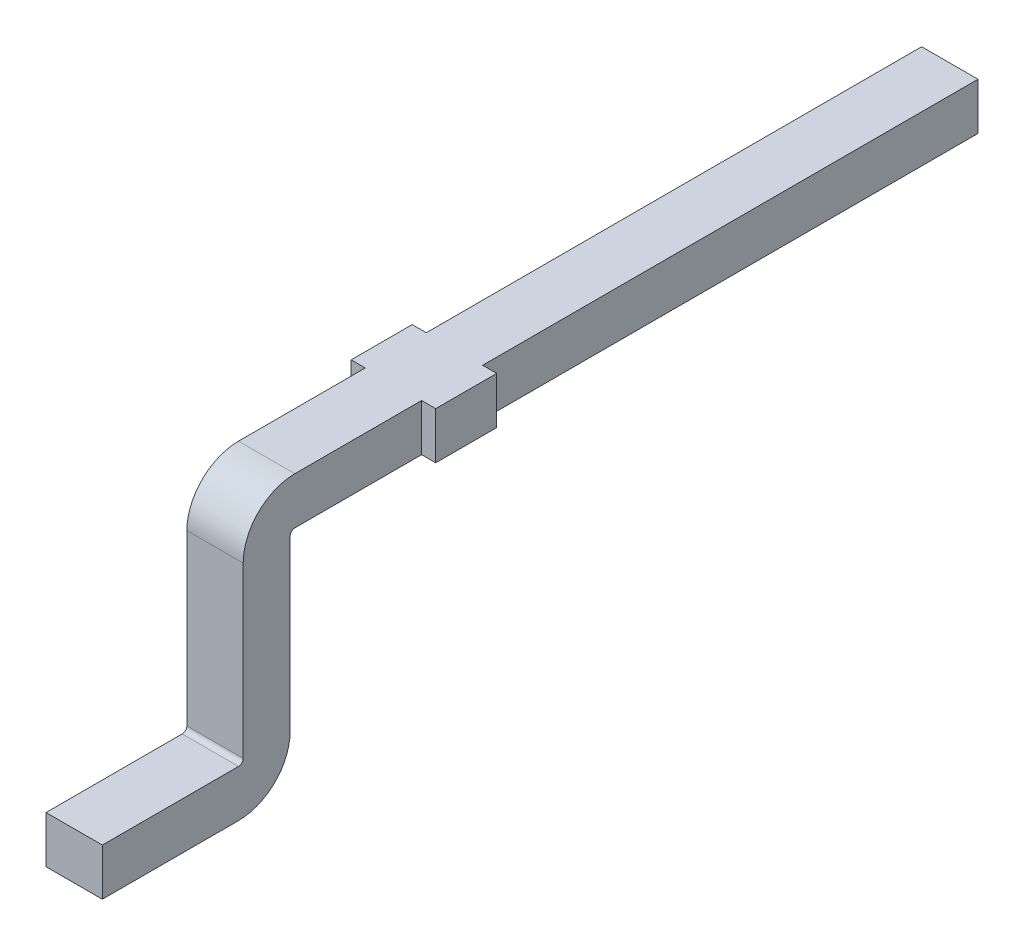
ISO-10303-21;
HEADER;
FILE_DESCRIPTION(('STEP AP214'),'2;1');
FILE_NAME('part.step','',(''),(''),'','','');
FILE_SCHEMA(('AUTOMOTIVE_DESIGN { 1 0 10303 214 1 1 1 1 }'));
ENDSEC;
DATA;
#1=APPLICATION_CONTEXT('core data for automotive mechanical design processes');
#2=APPLICATION_PROTOCOL_DEFINITION('international standard','automotive_design',2000,#1);
#3=PRODUCT_CONTEXT('',#1,'mechanical');
#4=PRODUCT('Part','Part','',(#3));
#5=PRODUCT_RELATED_PRODUCT_CATEGORY('part','',(#4));
#6=PRODUCT_DEFINITION_FORMATION('','',#4);
#7=PRODUCT_DEFINITION_CONTEXT('part definition',#1,'design');
#8=PRODUCT_DEFINITION('design','',#6,#7);
#9=PRODUCT_DEFINITION_SHAPE('','',#8);
#10=(LENGTH_UNIT() NAMED_UNIT(*) SI_UNIT(.MILLI.,.METRE.));
#11=(NAMED_UNIT(*) PLANE_ANGLE_UNIT() SI_UNIT($,.RADIAN.));
#12=(NAMED_UNIT(*) SI_UNIT($,.STERADIAN.) SOLID_ANGLE_UNIT());
#13=UNCERTAINTY_MEASURE_WITH_UNIT(LENGTH_MEASURE(1.E-05),#10,'distance_accuracy_value','');
#14=(GEOMETRIC_REPRESENTATION_CONTEXT(3) GLOBAL_UNCERTAINTY_ASSIGNED_CONTEXT((#13)) GLOBAL_UNIT_ASSIGNED_CONTEXT((#10,
#11,#12)) REPRESENTATION_CONTEXT('',''));
#15=CARTESIAN_POINT('',(0.,0.,0.));
#16=DIRECTION('',(0.,0.,1.));
#17=DIRECTION('',(1.,0.,0.));
#18=AXIS2_PLACEMENT_3D('',#15,#16,#17);
#19=CARTESIAN_POINT('',(5.,2.4,0.));
#20=DIRECTION('',(0.,0.,1.));
#21=DIRECTION('',(1.,0.,0.));
#22=AXIS2_PLACEMENT_3D('',#19,#20,#21);
#23=PLANE('',#22);
#24=DIRECTION('',(-1.,0.,0.));
#25=VECTOR('',#24,1.);
#26=CARTESIAN_POINT('',(5.,2.9,0.));
#27=LINE('',#26,#25);
#28=CARTESIAN_POINT('',(0.3,2.9,0.));
#29=VERTEX_POINT('',#28);
#30=CARTESIAN_POINT('',(-0.3,2.9,0.));
#31=VERTEX_POINT('',#30);
#32=EDGE_CURVE('E41',#29,#31,#27,.T.);
#33=ORIENTED_EDGE('',*,*,#32,.F.);
#34=DIRECTION('',(0.,-1.,0.));
#35=VECTOR('',#34,1.);
#36=CARTESIAN_POINT('',(0.3,2.9,0.));
#37=LINE('',#36,#35);
#38=CARTESIAN_POINT('',(0.3,2.4,0.));
#39=VERTEX_POINT('',#38);
#40=EDGE_CURVE('E11',#29,#39,#37,.T.);
#41=ORIENTED_EDGE('',*,*,#40,.T.);
#42=DIRECTION('',(-1.,0.,0.));
#43=VECTOR('',#42,1.);
#44=CARTESIAN_POINT('',(5.,2.4,0.));
#45=LINE('',#44,#43);
#46=CARTESIAN_POINT('',(-0.3,2.4,0.));
#47=VERTEX_POINT('',#46);
#48=EDGE_CURVE('E27',#39,#47,#45,.T.);
#49=ORIENTED_EDGE('',*,*,#48,.T.);
#50=DIRECTION('',(0.,-1.,0.));
#51=VECTOR('',#50,1.);
#52=CARTESIAN_POINT('',(-0.3,2.9,0.));
#53=LINE('',#52,#51);
#54=EDGE_CURVE('E218',#31,#47,#53,.T.);
#55=ORIENTED_EDGE('',*,*,#54,.F.);
#56=EDGE_LOOP('',(#33,#41,#49,#55));
#57=FACE_BOUND('',#56,.T.);
#58=ADVANCED_FACE('F16',(#57),#23,.F.);
#59=CARTESIAN_POINT('',(5.,2.9,0.));
#60=DIRECTION('',(0.,-1.,0.));
#61=DIRECTION('',(0.,0.,-1.));
#62=AXIS2_PLACEMENT_3D('',#59,#60,#61);
#63=PLANE('',#62);
#64=DIRECTION('',(-1.,0.,0.));
#65=VECTOR('',#64,1.);
#66=CARTESIAN_POINT('',(0.,2.9,5.275));
#67=LINE('',#66,#65);
#68=CARTESIAN_POINT('',(0.45,2.9,5.275));
#69=VERTEX_POINT('',#68);
#70=CARTESIAN_POINT('',(0.3,2.9,5.275));
#71=VERTEX_POINT('',#70);
#72=EDGE_CURVE('E289',#69,#71,#67,.T.);
#73=ORIENTED_EDGE('',*,*,#72,.T.);
#74=DIRECTION('',(0.,0.,-1.));
#75=VECTOR('',#74,1.);
#76=CARTESIAN_POINT('',(0.3,2.9,0.));
#77=LINE('',#76,#75);
#78=EDGE_CURVE('E292',#71,#29,#77,.T.);
#79=ORIENTED_EDGE('',*,*,#78,.T.);
#80=ORIENTED_EDGE('',*,*,#32,.T.);
#81=DIRECTION('',(0.,0.,-1.));
#82=VECTOR('',#81,1.);
#83=CARTESIAN_POINT('',(-0.3,2.9,0.));
#84=LINE('',#83,#82);
#85=CARTESIAN_POINT('',(-0.3,2.9,5.275));
#86=VERTEX_POINT('',#85);
#87=EDGE_CURVE('E207',#86,#31,#84,.T.);
#88=ORIENTED_EDGE('',*,*,#87,.F.);
#89=DIRECTION('',(1.,0.,0.));
#90=VECTOR('',#89,1.);
#91=CARTESIAN_POINT('',(0.,2.9,5.275));
#92=LINE('',#91,#90);
#93=CARTESIAN_POINT('',(-0.45,2.9,5.275));
#94=VERTEX_POINT('',#93);
#95=EDGE_CURVE('E211',#94,#86,#92,.T.);
#96=ORIENTED_EDGE('',*,*,#95,.F.);
#97=DIRECTION('',(0.,0.,-1.));
#98=VECTOR('',#97,1.);
#99=CARTESIAN_POINT('',(-0.45,2.9,0.));
#100=LINE('',#99,#98);
#101=CARTESIAN_POINT('',(-0.45,2.9,5.925));
#102=VERTEX_POINT('',#101);
#103=EDGE_CURVE('E406',#102,#94,#100,.T.);
#104=ORIENTED_EDGE('',*,*,#103,.F.);
#105=DIRECTION('',(-1.,0.,0.));
#106=VECTOR('',#105,1.);
#107=CARTESIAN_POINT('',(0.,2.9,5.925));
#108=LINE('',#107,#106);
#109=CARTESIAN_POINT('',(-0.3,2.9,5.925));
#110=VERTEX_POINT('',#109);
#111=EDGE_CURVE('E261',#110,#102,#108,.T.);
#112=ORIENTED_EDGE('',*,*,#111,.F.);
#113=DIRECTION('',(0.,0.,-1.));
#114=VECTOR('',#113,1.);
#115=CARTESIAN_POINT('',(-0.3,2.9,0.));
#116=LINE('',#115,#114);
#117=CARTESIAN_POINT('',(-0.3,2.9,7.275));
#118=VERTEX_POINT('',#117);
#119=EDGE_CURVE('E298',#118,#110,#116,.T.);
#120=ORIENTED_EDGE('',*,*,#119,.F.);
#121=DIRECTION('',(-1.,0.,0.));
#122=VECTOR('',#121,1.);
#123=CARTESIAN_POINT('',(5.,2.9,7.275));
#124=LINE('',#123,#122);
#125=CARTESIAN_POINT('',(0.3,2.9,7.275));
#126=VERTEX_POINT('',#125);
#127=EDGE_CURVE('E247',#126,#118,#124,.T.);
#128=ORIENTED_EDGE('',*,*,#127,.F.);
#129=DIRECTION('',(0.,0.,-1.));
#130=VECTOR('',#129,1.);
#131=CARTESIAN_POINT('',(0.3,2.9,0.));
#132=LINE('',#131,#130);
#133=CARTESIAN_POINT('',(0.3,2.9,5.925));
#134=VERTEX_POINT('',#133);
#135=EDGE_CURVE('E356',#126,#134,#132,.T.);
#136=ORIENTED_EDGE('',*,*,#135,.T.);
#137=DIRECTION('',(1.,0.,0.));
#138=VECTOR('',#137,1.);
#139=CARTESIAN_POINT('',(0.,2.9,5.925));
#140=LINE('',#139,#138);
#141=CARTESIAN_POINT('',(0.45,2.9,5.925));
#142=VERTEX_POINT('',#141);
#143=EDGE_CURVE('E352',#134,#142,#140,.T.);
#144=ORIENTED_EDGE('',*,*,#143,.T.);
#145=DIRECTION('',(0.,0.,-1.));
#146=VECTOR('',#145,1.);
#147=CARTESIAN_POINT('',(0.45,2.9,0.));
#148=LINE('',#147,#146);
#149=EDGE_CURVE('E241',#142,#69,#148,.T.);
#150=ORIENTED_EDGE('',*,*,#149,.T.);
#151=EDGE_LOOP('',(#73,#79,#80,#88,#96,#104,#112,#120,#128,#136,#144,#150));
#152=FACE_BOUND('',#151,.T.);
#153=ADVANCED_FACE('F210',(#152),#63,.F.);
#154=CARTESIAN_POINT('',(5.,2.35,7.275));
#155=DIRECTION('',(-1.,0.,0.));
#156=DIRECTION('',(0.,0.,1.));
#157=AXIS2_PLACEMENT_3D('',#154,#155,#156);
#158=CYLINDRICAL_SURFACE('',#157,0.55);
#159=DIRECTION('',(-1.,0.,0.));
#160=VECTOR('',#159,1.);
#161=CARTESIAN_POINT('',(5.,2.35,7.825));
#162=LINE('',#161,#160);
#163=CARTESIAN_POINT('',(0.3,2.35,7.825));
#164=VERTEX_POINT('',#163);
#165=CARTESIAN_POINT('',(-0.3,2.35,7.825));
#166=VERTEX_POINT('',#165);
#167=EDGE_CURVE('E248',#164,#166,#162,.T.);
#168=ORIENTED_EDGE('',*,*,#167,.F.);
#169=CARTESIAN_POINT('',(0.3,2.35,7.275));
#170=DIRECTION('',(-1.,0.,0.));
#171=DIRECTION('',(0.,0.,1.));
#172=AXIS2_PLACEMENT_3D('',#169,#170,#171);
#173=CIRCLE('',#172,0.55);
#174=EDGE_CURVE('E378',#164,#126,#173,.T.);
#175=ORIENTED_EDGE('',*,*,#174,.T.);
#176=ORIENTED_EDGE('',*,*,#127,.T.);
#177=CARTESIAN_POINT('',(-0.3,2.35,7.275));
#178=DIRECTION('',(-1.,0.,0.));
#179=DIRECTION('',(0.,0.,1.));
#180=AXIS2_PLACEMENT_3D('',#177,#178,#179);
#181=CIRCLE('',#180,0.55);
#182=EDGE_CURVE('E260',#166,#118,#181,.T.);
#183=ORIENTED_EDGE('',*,*,#182,.F.);
#184=EDGE_LOOP('',(#168,#175,#176,#183));
#185=FACE_BOUND('',#184,.T.);
#186=ADVANCED_FACE('F477',(#185),#158,.T.);
#187=CARTESIAN_POINT('',(5.,2.35,7.825));
#188=DIRECTION('',(0.,0.,-1.));
#189=DIRECTION('',(-1.,0.,0.));
#190=AXIS2_PLACEMENT_3D('',#187,#188,#189);
#191=PLANE('',#190);
#192=DIRECTION('',(-1.,0.,0.));
#193=VECTOR('',#192,1.);
#194=CARTESIAN_POINT('',(5.,0.55,7.825));
#195=LINE('',#194,#193);
#196=CARTESIAN_POINT('',(0.3,0.55,7.825));
#197=VERTEX_POINT('',#196);
#198=CARTESIAN_POINT('',(-0.3,0.55,7.825));
#199=VERTEX_POINT('',#198);
#200=EDGE_CURVE('E20',#197,#199,#195,.T.);
#201=ORIENTED_EDGE('',*,*,#200,.F.);
#202=DIRECTION('',(0.,1.,0.));
#203=VECTOR('',#202,1.);
#204=CARTESIAN_POINT('',(0.3,2.35,7.825));
#205=LINE('',#204,#203);
#206=EDGE_CURVE('E243',#197,#164,#205,.T.);
#207=ORIENTED_EDGE('',*,*,#206,.T.);
#208=ORIENTED_EDGE('',*,*,#167,.T.);
#209=DIRECTION('',(0.,1.,0.));
#210=VECTOR('',#209,1.);
#211=CARTESIAN_POINT('',(-0.3,2.35,7.825));
#212=LINE('',#211,#210);
#213=EDGE_CURVE('E325',#199,#166,#212,.T.);
#214=ORIENTED_EDGE('',*,*,#213,.F.);
#215=EDGE_LOOP('',(#201,#207,#208,#214));
#216=FACE_BOUND('',#215,.T.);
#217=ADVANCED_FACE('F487',(#216),#191,.F.);
#218=CARTESIAN_POINT('',(5.,0.55,7.875));
#219=DIRECTION('',(-1.,0.,0.));
#220=DIRECTION('',(0.,0.,1.));
#221=AXIS2_PLACEMENT_3D('',#218,#219,#220);
#222=CYLINDRICAL_SURFACE('',#221,0.05);
#223=DIRECTION('',(-1.,0.,0.));
#224=VECTOR('',#223,1.);
#225=CARTESIAN_POINT('',(5.,0.5,7.875));
#226=LINE('',#225,#224);
#227=CARTESIAN_POINT('',(0.3,0.5,7.875));
#228=VERTEX_POINT('',#227);
#229=CARTESIAN_POINT('',(-0.3,0.5,7.875));
#230=VERTEX_POINT('',#229);
#231=EDGE_CURVE('E249',#228,#230,#226,.T.);
#232=ORIENTED_EDGE('',*,*,#231,.F.);
#233=CARTESIAN_POINT('',(0.3,0.55,7.875));
#234=DIRECTION('',(1.,0.,0.));
#235=DIRECTION('',(0.,0.,1.));
#236=AXIS2_PLACEMENT_3D('',#233,#234,#235);
#237=CIRCLE('',#236,0.05);
#238=EDGE_CURVE('E283',#228,#197,#237,.T.);
#239=ORIENTED_EDGE('',*,*,#238,.T.);
#240=ORIENTED_EDGE('',*,*,#200,.T.);
#241=CARTESIAN_POINT('',(-0.3,0.55,7.875));
#242=DIRECTION('',(1.,0.,0.));
#243=DIRECTION('',(0.,0.,1.));
#244=AXIS2_PLACEMENT_3D('',#241,#242,#243);
#245=CIRCLE('',#244,0.05);
#246=EDGE_CURVE('E305',#230,#199,#245,.T.);
#247=ORIENTED_EDGE('',*,*,#246,.F.);
#248=EDGE_LOOP('',(#232,#239,#240,#247));
#249=FACE_BOUND('',#248,.T.);
#250=ADVANCED_FACE('F483',(#249),#222,.F.);
#251=CARTESIAN_POINT('',(5.,0.5,7.875));
#252=DIRECTION('',(0.,-1.,0.));
#253=DIRECTION('',(0.,0.,-1.));
#254=AXIS2_PLACEMENT_3D('',#251,#252,#253);
#255=PLANE('',#254);
#256=DIRECTION('',(-1.,0.,0.));
#257=VECTOR('',#256,1.);
#258=CARTESIAN_POINT('',(5.,0.5,9.325));
#259=LINE('',#258,#257);
#260=CARTESIAN_POINT('',(0.3,0.5,9.325));
#261=VERTEX_POINT('',#260);
#262=CARTESIAN_POINT('',(-0.3,0.5,9.325));
#263=VERTEX_POINT('',#262);
#264=EDGE_CURVE('E254',#261,#263,#259,.T.);
#265=ORIENTED_EDGE('',*,*,#264,.F.);
#266=DIRECTION('',(0.,0.,-1.));
#267=VECTOR('',#266,1.);
#268=CARTESIAN_POINT('',(0.3,0.5,7.875));
#269=LINE('',#268,#267);
#270=EDGE_CURVE('E253',#261,#228,#269,.T.);
#271=ORIENTED_EDGE('',*,*,#270,.T.);
#272=ORIENTED_EDGE('',*,*,#231,.T.);
#273=DIRECTION('',(0.,0.,-1.));
#274=VECTOR('',#273,1.);
#275=CARTESIAN_POINT('',(-0.3,0.5,7.875));
#276=LINE('',#275,#274);
#277=EDGE_CURVE('E300',#263,#230,#276,.T.);
#278=ORIENTED_EDGE('',*,*,#277,.F.);
#279=EDGE_LOOP('',(#265,#271,#272,#278));
#280=FACE_BOUND('',#279,.T.);
#281=ADVANCED_FACE('F486',(#280),#255,.F.);
#282=CARTESIAN_POINT('',(5.,0.5,9.325));
#283=DIRECTION('',(0.,0.,-1.));
#284=DIRECTION('',(0.,-1.,0.));
#285=AXIS2_PLACEMENT_3D('',#282,#283,#284);
#286=PLANE('',#285);
#287=DIRECTION('',(-1.,0.,0.));
#288=VECTOR('',#287,1.);
#289=CARTESIAN_POINT('',(5.,0.,9.325));
#290=LINE('',#289,#288);
#291=CARTESIAN_POINT('',(0.3,0.,9.325));
#292=VERTEX_POINT('',#291);
#293=CARTESIAN_POINT('',(-0.3,0.,9.325));
#294=VERTEX_POINT('',#293);
#295=EDGE_CURVE('E360',#292,#294,#290,.T.);
#296=ORIENTED_EDGE('',*,*,#295,.F.);
#297=DIRECTION('',(0.,-1.,0.));
#298=VECTOR('',#297,1.);
#299=CARTESIAN_POINT('',(0.3,2.9,9.325));
#300=LINE('',#299,#298);
#301=EDGE_CURVE('E335',#261,#292,#300,.T.);
#302=ORIENTED_EDGE('',*,*,#301,.F.);
#303=ORIENTED_EDGE('',*,*,#264,.T.);
#304=DIRECTION('',(0.,-1.,0.));
#305=VECTOR('',#304,1.);
#306=CARTESIAN_POINT('',(-0.3,2.9,9.325));
#307=LINE('',#306,#305);
#308=EDGE_CURVE('E315',#263,#294,#307,.T.);
#309=ORIENTED_EDGE('',*,*,#308,.T.);
#310=EDGE_LOOP('',(#296,#302,#303,#309));
#311=FACE_BOUND('',#310,.T.);
#312=ADVANCED_FACE('F468',(#311),#286,.F.);
#313=CARTESIAN_POINT('',(5.,0.,9.325));
#314=DIRECTION('',(0.,1.,0.));
#315=DIRECTION('',(1.,0.,0.));
#316=AXIS2_PLACEMENT_3D('',#313,#314,#315);
#317=PLANE('',#316);
#318=DIRECTION('',(-1.,0.,0.));
#319=VECTOR('',#318,1.);
#320=CARTESIAN_POINT('',(5.,0.,7.875));
#321=LINE('',#320,#319);
#322=CARTESIAN_POINT('',(0.3,0.,7.875));
#323=VERTEX_POINT('',#322);
#324=CARTESIAN_POINT('',(-0.3,0.,7.875));
#325=VERTEX_POINT('',#324);
#326=EDGE_CURVE('E193',#323,#325,#321,.T.);
#327=ORIENTED_EDGE('',*,*,#326,.F.);
#328=DIRECTION('',(0.,0.,-1.));
#329=VECTOR('',#328,1.);
#330=CARTESIAN_POINT('',(0.3,0.,0.));
#331=LINE('',#330,#329);
#332=EDGE_CURVE('E179',#292,#323,#331,.T.);
#333=ORIENTED_EDGE('',*,*,#332,.F.);
#334=ORIENTED_EDGE('',*,*,#295,.T.);
#335=DIRECTION('',(0.,0.,-1.));
#336=VECTOR('',#335,1.);
#337=CARTESIAN_POINT('',(-0.3,0.,0.));
#338=LINE('',#337,#336);
#339=EDGE_CURVE('E357',#294,#325,#338,.T.);
#340=ORIENTED_EDGE('',*,*,#339,.T.);
#341=EDGE_LOOP('',(#327,#333,#334,#340));
#342=FACE_BOUND('',#341,.T.);
#343=ADVANCED_FACE('F460',(#342),#317,.F.);
#344=CARTESIAN_POINT('',(5.,0.55,7.875));
#345=DIRECTION('',(-1.,0.,0.));
#346=DIRECTION('',(0.,0.,1.));
#347=AXIS2_PLACEMENT_3D('',#344,#345,#346);
#348=CYLINDRICAL_SURFACE('',#347,0.55);
#349=DIRECTION('',(-1.,0.,0.));
#350=VECTOR('',#349,1.);
#351=CARTESIAN_POINT('',(5.,0.55,7.325));
#352=LINE('',#351,#350);
#353=CARTESIAN_POINT('',(0.3,0.55,7.325));
#354=VERTEX_POINT('',#353);
#355=CARTESIAN_POINT('',(-0.3,0.55,7.325));
#356=VERTEX_POINT('',#355);
#357=EDGE_CURVE('E288',#354,#356,#352,.T.);
#358=ORIENTED_EDGE('',*,*,#357,.F.);
#359=CARTESIAN_POINT('',(0.3,0.55,7.875));
#360=DIRECTION('',(-1.,0.,0.));
#361=DIRECTION('',(0.,0.,1.));
#362=AXIS2_PLACEMENT_3D('',#359,#360,#361);
#363=CIRCLE('',#362,0.55);
#364=EDGE_CURVE('E328',#354,#323,#363,.T.);
#365=ORIENTED_EDGE('',*,*,#364,.T.);
#366=ORIENTED_EDGE('',*,*,#326,.T.);
#367=CARTESIAN_POINT('',(-0.3,0.55,7.875));
#368=DIRECTION('',(-1.,0.,0.));
#369=DIRECTION('',(0.,0.,1.));
#370=AXIS2_PLACEMENT_3D('',#367,#368,#369);
#371=CIRCLE('',#370,0.55);
#372=EDGE_CURVE('E304',#356,#325,#371,.T.);
#373=ORIENTED_EDGE('',*,*,#372,.F.);
#374=EDGE_LOOP('',(#358,#365,#366,#373));
#375=FACE_BOUND('',#374,.T.);
#376=ADVANCED_FACE('F458',(#375),#348,.T.);
#377=CARTESIAN_POINT('',(5.,0.55,7.325));
#378=DIRECTION('',(0.,0.,1.));
#379=DIRECTION('',(1.,0.,0.));
#380=AXIS2_PLACEMENT_3D('',#377,#378,#379);
#381=PLANE('',#380);
#382=DIRECTION('',(-1.,0.,0.));
#383=VECTOR('',#382,1.);
#384=CARTESIAN_POINT('',(5.,2.35,7.325));
#385=LINE('',#384,#383);
#386=CARTESIAN_POINT('',(0.3,2.35,7.325));
#387=VERTEX_POINT('',#386);
#388=CARTESIAN_POINT('',(-0.3,2.35,7.325));
#389=VERTEX_POINT('',#388);
#390=EDGE_CURVE('E320',#387,#389,#385,.T.);
#391=ORIENTED_EDGE('',*,*,#390,.F.);
#392=DIRECTION('',(0.,-1.,0.));
#393=VECTOR('',#392,1.);
#394=CARTESIAN_POINT('',(0.3,0.55,7.325));
#395=LINE('',#394,#393);
#396=EDGE_CURVE('E284',#387,#354,#395,.T.);
#397=ORIENTED_EDGE('',*,*,#396,.T.);
#398=ORIENTED_EDGE('',*,*,#357,.T.);
#399=DIRECTION('',(0.,-1.,0.));
#400=VECTOR('',#399,1.);
#401=CARTESIAN_POINT('',(-0.3,0.55,7.325));
#402=LINE('',#401,#400);
#403=EDGE_CURVE('E329',#389,#356,#402,.T.);
#404=ORIENTED_EDGE('',*,*,#403,.F.);
#405=EDGE_LOOP('',(#391,#397,#398,#404));
#406=FACE_BOUND('',#405,.T.);
#407=ADVANCED_FACE('F446',(#406),#381,.F.);
#408=CARTESIAN_POINT('',(5.,2.35,7.275));
#409=DIRECTION('',(-1.,0.,0.));
#410=DIRECTION('',(0.,0.,1.));
#411=AXIS2_PLACEMENT_3D('',#408,#409,#410);
#412=CYLINDRICAL_SURFACE('',#411,0.05);
#413=DIRECTION('',(-1.,0.,0.));
#414=VECTOR('',#413,1.);
#415=CARTESIAN_POINT('',(5.,2.4,7.275));
#416=LINE('',#415,#414);
#417=CARTESIAN_POINT('',(0.3,2.4,7.275));
#418=VERTEX_POINT('',#417);
#419=CARTESIAN_POINT('',(-0.3,2.4,7.275));
#420=VERTEX_POINT('',#419);
#421=EDGE_CURVE('E255',#418,#420,#416,.T.);
#422=ORIENTED_EDGE('',*,*,#421,.F.);
#423=CARTESIAN_POINT('',(0.3,2.35,7.275));
#424=DIRECTION('',(1.,0.,0.));
#425=DIRECTION('',(0.,0.,1.));
#426=AXIS2_PLACEMENT_3D('',#423,#424,#425);
#427=CIRCLE('',#426,0.05);
#428=EDGE_CURVE('E336',#418,#387,#427,.T.);
#429=ORIENTED_EDGE('',*,*,#428,.T.);
#430=ORIENTED_EDGE('',*,*,#390,.T.);
#431=CARTESIAN_POINT('',(-0.3,2.35,7.275));
#432=DIRECTION('',(1.,0.,0.));
#433=DIRECTION('',(0.,0.,1.));
#434=AXIS2_PLACEMENT_3D('',#431,#432,#433);
#435=CIRCLE('',#434,0.05);
#436=EDGE_CURVE('E272',#420,#389,#435,.T.);
#437=ORIENTED_EDGE('',*,*,#436,.F.);
#438=EDGE_LOOP('',(#422,#429,#430,#437));
#439=FACE_BOUND('',#438,.T.);
#440=ADVANCED_FACE('F452',(#439),#412,.F.);
#441=CARTESIAN_POINT('',(5.,2.4,7.275));
#442=DIRECTION('',(0.,1.,0.));
#443=DIRECTION('',(1.,0.,0.));
#444=AXIS2_PLACEMENT_3D('',#441,#442,#443);
#445=PLANE('',#444);
#446=ORIENTED_EDGE('',*,*,#48,.F.);
#447=DIRECTION('',(0.,0.,1.));
#448=VECTOR('',#447,1.);
#449=CARTESIAN_POINT('',(0.3,2.4,7.275));
#450=LINE('',#449,#448);
#451=CARTESIAN_POINT('',(0.3,2.4,5.275));
#452=VERTEX_POINT('',#451);
#453=EDGE_CURVE('E316',#39,#452,#450,.T.);
#454=ORIENTED_EDGE('',*,*,#453,.T.);
#455=DIRECTION('',(1.,0.,0.));
#456=VECTOR('',#455,1.);
#457=CARTESIAN_POINT('',(5.,2.4,5.275));
#458=LINE('',#457,#456);
#459=CARTESIAN_POINT('',(0.45,2.4,5.275));
#460=VERTEX_POINT('',#459);
#461=EDGE_CURVE('E321',#452,#460,#458,.T.);
#462=ORIENTED_EDGE('',*,*,#461,.T.);
#463=DIRECTION('',(0.,0.,1.));
#464=VECTOR('',#463,1.);
#465=CARTESIAN_POINT('',(0.45,2.4,7.275));
#466=LINE('',#465,#464);
#467=CARTESIAN_POINT('',(0.45,2.4,5.925));
#468=VERTEX_POINT('',#467);
#469=EDGE_CURVE('E351',#460,#468,#466,.T.);
#470=ORIENTED_EDGE('',*,*,#469,.T.);
#471=DIRECTION('',(-1.,0.,0.));
#472=VECTOR('',#471,1.);
#473=CARTESIAN_POINT('',(5.,2.4,5.925));
#474=LINE('',#473,#472);
#475=CARTESIAN_POINT('',(0.3,2.4,5.925));
#476=VERTEX_POINT('',#475);
#477=EDGE_CURVE('E276',#468,#476,#474,.T.);
#478=ORIENTED_EDGE('',*,*,#477,.T.);
#479=DIRECTION('',(0.,0.,1.));
#480=VECTOR('',#479,1.);
#481=CARTESIAN_POINT('',(0.3,2.4,7.275));
#482=LINE('',#481,#480);
#483=EDGE_CURVE('E259',#476,#418,#482,.T.);
#484=ORIENTED_EDGE('',*,*,#483,.T.);
#485=ORIENTED_EDGE('',*,*,#421,.T.);
#486=DIRECTION('',(0.,0.,1.));
#487=VECTOR('',#486,1.);
#488=CARTESIAN_POINT('',(-0.3,2.4,7.275));
#489=LINE('',#488,#487);
#490=CARTESIAN_POINT('',(-0.3,2.4,5.925));
#491=VERTEX_POINT('',#490);
#492=EDGE_CURVE('E267',#491,#420,#489,.T.);
#493=ORIENTED_EDGE('',*,*,#492,.F.);
#494=DIRECTION('',(1.,0.,0.));
#495=VECTOR('',#494,1.);
#496=CARTESIAN_POINT('',(5.,2.4,5.925));
#497=LINE('',#496,#495);
#498=CARTESIAN_POINT('',(-0.45,2.4,5.925));
#499=VERTEX_POINT('',#498);
#500=EDGE_CURVE('E265',#499,#491,#497,.T.);
#501=ORIENTED_EDGE('',*,*,#500,.F.);
#502=DIRECTION('',(0.,0.,1.));
#503=VECTOR('',#502,1.);
#504=CARTESIAN_POINT('',(-0.45,2.4,7.275));
#505=LINE('',#504,#503);
#506=CARTESIAN_POINT('',(-0.45,2.4,5.275));
#507=VERTEX_POINT('',#506);
#508=EDGE_CURVE('E311',#507,#499,#505,.T.);
#509=ORIENTED_EDGE('',*,*,#508,.F.);
#510=DIRECTION('',(-1.,0.,0.));
#511=VECTOR('',#510,1.);
#512=CARTESIAN_POINT('',(5.,2.4,5.275));
#513=LINE('',#512,#511);
#514=CARTESIAN_POINT('',(-0.3,2.4,5.275));
#515=VERTEX_POINT('',#514);
#516=EDGE_CURVE('E228',#515,#507,#513,.T.);
#517=ORIENTED_EDGE('',*,*,#516,.F.);
#518=DIRECTION('',(0.,0.,1.));
#519=VECTOR('',#518,1.);
#520=CARTESIAN_POINT('',(-0.3,2.4,7.275));
#521=LINE('',#520,#519);
#522=EDGE_CURVE('E217',#47,#515,#521,.T.);
#523=ORIENTED_EDGE('',*,*,#522,.F.);
#524=EDGE_LOOP('',(#446,#454,#462,#470,#478,#484,#485,#493,#501,#509,#517,#523));
#525=FACE_BOUND('',#524,.T.);
#526=ADVANCED_FACE('F427',(#525),#445,.F.);
#527=CARTESIAN_POINT('',(-0.3,2.9,0.));
#528=DIRECTION('',(-1.,0.,0.));
#529=DIRECTION('',(0.,1.,0.));
#530=AXIS2_PLACEMENT_3D('',#527,#528,#529);
#531=PLANE('',#530);
#532=ORIENTED_EDGE('',*,*,#182,.T.);
#533=ORIENTED_EDGE('',*,*,#119,.T.);
#534=DIRECTION('',(0.,-1.,0.));
#535=VECTOR('',#534,1.);
#536=CARTESIAN_POINT('',(-0.3,2.9,5.925));
#537=LINE('',#536,#535);
#538=EDGE_CURVE('E271',#110,#491,#537,.T.);
#539=ORIENTED_EDGE('',*,*,#538,.T.);
#540=ORIENTED_EDGE('',*,*,#492,.T.);
#541=ORIENTED_EDGE('',*,*,#436,.T.);
#542=ORIENTED_EDGE('',*,*,#403,.T.);
#543=ORIENTED_EDGE('',*,*,#372,.T.);
#544=ORIENTED_EDGE('',*,*,#339,.F.);
#545=ORIENTED_EDGE('',*,*,#308,.F.);
#546=ORIENTED_EDGE('',*,*,#277,.T.);
#547=ORIENTED_EDGE('',*,*,#246,.T.);
#548=ORIENTED_EDGE('',*,*,#213,.T.);
#549=EDGE_LOOP('',(#532,#533,#539,#540,#541,#542,#543,#544,#545,#546,#547,#548));
#550=FACE_BOUND('',#549,.T.);
#551=ADVANCED_FACE('F449',(#550),#531,.T.);
#552=CARTESIAN_POINT('',(0.,2.9,5.925));
#553=DIRECTION('',(0.,0.,1.));
#554=DIRECTION('',(1.,0.,0.));
#555=AXIS2_PLACEMENT_3D('',#552,#553,#554);
#556=PLANE('',#555);
#557=ORIENTED_EDGE('',*,*,#500,.T.);
#558=ORIENTED_EDGE('',*,*,#538,.F.);
#559=ORIENTED_EDGE('',*,*,#111,.T.);
#560=DIRECTION('',(0.,-1.,0.));
#561=VECTOR('',#560,1.);
#562=CARTESIAN_POINT('',(-0.45,2.9,5.925));
#563=LINE('',#562,#561);
#564=EDGE_CURVE('E266',#102,#499,#563,.T.);
#565=ORIENTED_EDGE('',*,*,#564,.T.);
#566=EDGE_LOOP('',(#557,#558,#559,#565));
#567=FACE_BOUND('',#566,.T.);
#568=ADVANCED_FACE('F481',(#567),#556,.T.);
#569=CARTESIAN_POINT('',(-0.45,2.9,0.));
#570=DIRECTION('',(-1.,0.,0.));
#571=DIRECTION('',(0.,1.,0.));
#572=AXIS2_PLACEMENT_3D('',#569,#570,#571);
#573=PLANE('',#572);
#574=ORIENTED_EDGE('',*,*,#508,.T.);
#575=ORIENTED_EDGE('',*,*,#564,.F.);
#576=ORIENTED_EDGE('',*,*,#103,.T.);
#577=DIRECTION('',(0.,-1.,0.));
#578=VECTOR('',#577,1.);
#579=CARTESIAN_POINT('',(-0.45,2.9,5.275));
#580=LINE('',#579,#578);
#581=EDGE_CURVE('E226',#94,#507,#580,.T.);
#582=ORIENTED_EDGE('',*,*,#581,.T.);
#583=EDGE_LOOP('',(#574,#575,#576,#582));
#584=FACE_BOUND('',#583,.T.);
#585=ADVANCED_FACE('F433',(#584),#573,.T.);
#586=CARTESIAN_POINT('',(0.,2.9,5.275));
#587=DIRECTION('',(0.,0.,-1.));
#588=DIRECTION('',(0.,-1.,0.));
#589=AXIS2_PLACEMENT_3D('',#586,#587,#588);
#590=PLANE('',#589);
#591=ORIENTED_EDGE('',*,*,#516,.T.);
#592=ORIENTED_EDGE('',*,*,#581,.F.);
#593=ORIENTED_EDGE('',*,*,#95,.T.);
#594=DIRECTION('',(0.,-1.,0.));
#595=VECTOR('',#594,1.);
#596=CARTESIAN_POINT('',(-0.3,2.9,5.275));
#597=LINE('',#596,#595);
#598=EDGE_CURVE('E224',#86,#515,#597,.T.);
#599=ORIENTED_EDGE('',*,*,#598,.T.);
#600=EDGE_LOOP('',(#591,#592,#593,#599));
#601=FACE_BOUND('',#600,.T.);
#602=ADVANCED_FACE('F223',(#601),#590,.T.);
#603=CARTESIAN_POINT('',(-0.3,2.9,0.));
#604=DIRECTION('',(-1.,0.,0.));
#605=DIRECTION('',(0.,1.,0.));
#606=AXIS2_PLACEMENT_3D('',#603,#604,#605);
#607=PLANE('',#606);
#608=ORIENTED_EDGE('',*,*,#522,.T.);
#609=ORIENTED_EDGE('',*,*,#598,.F.);
#610=ORIENTED_EDGE('',*,*,#87,.T.);
#611=ORIENTED_EDGE('',*,*,#54,.T.);
#612=EDGE_LOOP('',(#608,#609,#610,#611));
#613=FACE_BOUND('',#612,.T.);
#614=ADVANCED_FACE('F18',(#613),#607,.T.);
#615=CARTESIAN_POINT('',(0.3,2.9,0.));
#616=DIRECTION('',(-1.,0.,0.));
#617=DIRECTION('',(0.,1.,0.));
#618=AXIS2_PLACEMENT_3D('',#615,#616,#617);
#619=PLANE('',#618);
#620=ORIENTED_EDGE('',*,*,#40,.F.);
#621=ORIENTED_EDGE('',*,*,#78,.F.);
#622=DIRECTION('',(0.,-1.,0.));
#623=VECTOR('',#622,1.);
#624=CARTESIAN_POINT('',(0.3,2.9,5.275));
#625=LINE('',#624,#623);
#626=EDGE_CURVE('E340',#71,#452,#625,.T.);
#627=ORIENTED_EDGE('',*,*,#626,.T.);
#628=ORIENTED_EDGE('',*,*,#453,.F.);
#629=EDGE_LOOP('',(#620,#621,#627,#628));
#630=FACE_BOUND('',#629,.T.);
#631=ADVANCED_FACE('F830',(#630),#619,.F.);
#632=CARTESIAN_POINT('',(0.,2.9,5.275));
#633=DIRECTION('',(0.,0.,1.));
#634=DIRECTION('',(1.,0.,0.));
#635=AXIS2_PLACEMENT_3D('',#632,#633,#634);
#636=PLANE('',#635);
#637=ORIENTED_EDGE('',*,*,#626,.F.);
#638=ORIENTED_EDGE('',*,*,#72,.F.);
#639=DIRECTION('',(0.,-1.,0.));
#640=VECTOR('',#639,1.);
#641=CARTESIAN_POINT('',(0.45,2.9,5.275));
#642=LINE('',#641,#640);
#643=EDGE_CURVE('E344',#69,#460,#642,.T.);
#644=ORIENTED_EDGE('',*,*,#643,.T.);
#645=ORIENTED_EDGE('',*,*,#461,.F.);
#646=EDGE_LOOP('',(#637,#638,#644,#645));
#647=FACE_BOUND('',#646,.T.);
#648=ADVANCED_FACE('F818',(#647),#636,.F.);
#649=CARTESIAN_POINT('',(0.45,2.9,0.));
#650=DIRECTION('',(-1.,0.,0.));
#651=DIRECTION('',(0.,0.,1.));
#652=AXIS2_PLACEMENT_3D('',#649,#650,#651);
#653=PLANE('',#652);
#654=ORIENTED_EDGE('',*,*,#643,.F.);
#655=ORIENTED_EDGE('',*,*,#149,.F.);
#656=DIRECTION('',(0.,-1.,0.));
#657=VECTOR('',#656,1.);
#658=CARTESIAN_POINT('',(0.45,2.9,5.925));
#659=LINE('',#658,#657);
#660=EDGE_CURVE('E372',#142,#468,#659,.T.);
#661=ORIENTED_EDGE('',*,*,#660,.T.);
#662=ORIENTED_EDGE('',*,*,#469,.F.);
#663=EDGE_LOOP('',(#654,#655,#661,#662));
#664=FACE_BOUND('',#663,.T.);
#665=ADVANCED_FACE('F497',(#664),#653,.F.);
#666=CARTESIAN_POINT('',(0.,2.9,5.925));
#667=DIRECTION('',(0.,0.,-1.));
#668=DIRECTION('',(0.,-1.,0.));
#669=AXIS2_PLACEMENT_3D('',#666,#667,#668);
#670=PLANE('',#669);
#671=ORIENTED_EDGE('',*,*,#660,.F.);
#672=ORIENTED_EDGE('',*,*,#143,.F.);
#673=DIRECTION('',(0.,-1.,0.));
#674=VECTOR('',#673,1.);
#675=CARTESIAN_POINT('',(0.3,2.9,5.925));
#676=LINE('',#675,#674);
#677=EDGE_CURVE('E363',#134,#476,#676,.T.);
#678=ORIENTED_EDGE('',*,*,#677,.T.);
#679=ORIENTED_EDGE('',*,*,#477,.F.);
#680=EDGE_LOOP('',(#671,#672,#678,#679));
#681=FACE_BOUND('',#680,.T.);
#682=ADVANCED_FACE('F495',(#681),#670,.F.);
#683=CARTESIAN_POINT('',(0.3,2.9,0.));
#684=DIRECTION('',(-1.,0.,0.));
#685=DIRECTION('',(0.,0.,1.));
#686=AXIS2_PLACEMENT_3D('',#683,#684,#685);
#687=PLANE('',#686);
#688=ORIENTED_EDGE('',*,*,#206,.F.);
#689=ORIENTED_EDGE('',*,*,#238,.F.);
#690=ORIENTED_EDGE('',*,*,#270,.F.);
#691=ORIENTED_EDGE('',*,*,#301,.T.);
#692=ORIENTED_EDGE('',*,*,#332,.T.);
#693=ORIENTED_EDGE('',*,*,#364,.F.);
#694=ORIENTED_EDGE('',*,*,#396,.F.);
#695=ORIENTED_EDGE('',*,*,#428,.F.);
#696=ORIENTED_EDGE('',*,*,#483,.F.);
#697=ORIENTED_EDGE('',*,*,#677,.F.);
#698=ORIENTED_EDGE('',*,*,#135,.F.);
#699=ORIENTED_EDGE('',*,*,#174,.F.);
#700=EDGE_LOOP('',(#688,#689,#690,#691,#692,#693,#694,#695,#696,#697,#698,#699));
#701=FACE_BOUND('',#700,.T.);
#702=ADVANCED_FACE('F456',(#701),#687,.F.);
#703=CLOSED_SHELL('',(#58,#153,#186,#217,#250,#281,#312,#343,#376,#407,#440,#526,#551,#568,#585,
#602,#614,#631,#648,#665,#682,#702));
#704=MANIFOLD_SOLID_BREP('B1',#703);
#705=ADVANCED_BREP_SHAPE_REPRESENTATION('',(#18,#704),#14);
#706=SHAPE_DEFINITION_REPRESENTATION(#9,#705);
ENDSEC;
END-ISO-10303-21;
